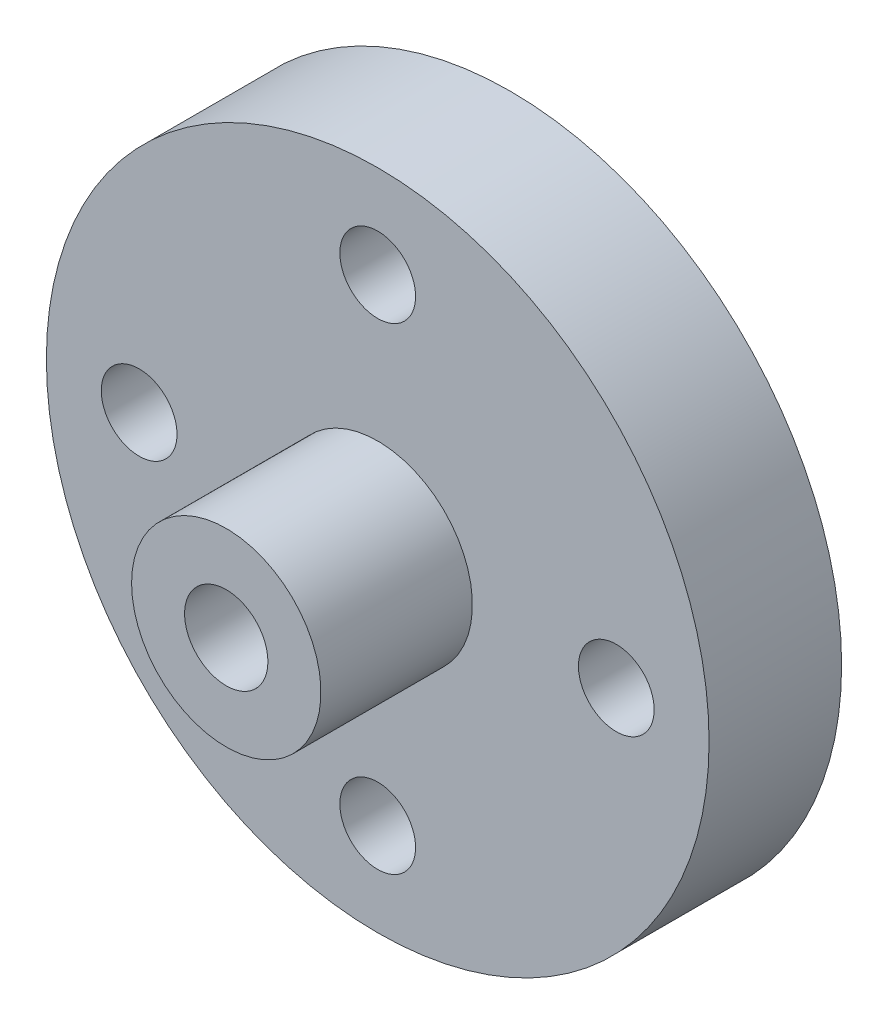
ISO-10303-21;
HEADER;
FILE_DESCRIPTION(('STEP AP214'),'2;1');
FILE_NAME('part.step','',(''),(''),'','','');
FILE_SCHEMA(('AUTOMOTIVE_DESIGN { 1 0 10303 214 1 1 1 1 }'));
ENDSEC;
DATA;
#1=APPLICATION_CONTEXT('core data for automotive mechanical design processes');
#2=APPLICATION_PROTOCOL_DEFINITION('international standard','automotive_design',2000,#1);
#3=PRODUCT_CONTEXT('',#1,'mechanical');
#4=PRODUCT('Part','Part','',(#3));
#5=PRODUCT_RELATED_PRODUCT_CATEGORY('part','',(#4));
#6=PRODUCT_DEFINITION_FORMATION('','',#4);
#7=PRODUCT_DEFINITION_CONTEXT('part definition',#1,'design');
#8=PRODUCT_DEFINITION('design','',#6,#7);
#9=PRODUCT_DEFINITION_SHAPE('','',#8);
#10=(LENGTH_UNIT() NAMED_UNIT(*) SI_UNIT(.MILLI.,.METRE.));
#11=(NAMED_UNIT(*) PLANE_ANGLE_UNIT() SI_UNIT($,.RADIAN.));
#12=(NAMED_UNIT(*) SI_UNIT($,.STERADIAN.) SOLID_ANGLE_UNIT());
#13=UNCERTAINTY_MEASURE_WITH_UNIT(LENGTH_MEASURE(1.E-05),#10,'distance_accuracy_value','');
#14=(GEOMETRIC_REPRESENTATION_CONTEXT(3) GLOBAL_UNCERTAINTY_ASSIGNED_CONTEXT((#13)) GLOBAL_UNIT_ASSIGNED_CONTEXT((#10,
#11,#12)) REPRESENTATION_CONTEXT('',''));
#15=CARTESIAN_POINT('',(0.,0.,0.));
#16=DIRECTION('',(0.,0.,1.));
#17=DIRECTION('',(1.,0.,0.));
#18=AXIS2_PLACEMENT_3D('',#15,#16,#17);
#19=CARTESIAN_POINT('',(0.,0.,3.175));
#20=DIRECTION('',(0.,0.,1.));
#21=DIRECTION('',(1.,0.,0.));
#22=AXIS2_PLACEMENT_3D('',#19,#20,#21);
#23=PLANE('',#22);
#24=CARTESIAN_POINT('',(0.,0.,3.175));
#25=DIRECTION('',(0.,0.,1.));
#26=DIRECTION('',(1.,0.,0.));
#27=AXIS2_PLACEMENT_3D('',#24,#25,#26);
#28=CIRCLE('',#27,1.397);
#29=CARTESIAN_POINT('',(1.397,0.,3.175));
#30=VERTEX_POINT('',#29);
#31=EDGE_CURVE('E17',#30,#30,#28,.T.);
#32=ORIENTED_EDGE('',*,*,#31,.T.);
#33=EDGE_LOOP('',(#32));
#34=FACE_BOUND('',#33,.T.);
#35=CARTESIAN_POINT('',(0.,0.,3.175));
#36=DIRECTION('',(0.,0.,-1.));
#37=DIRECTION('',(-1.,0.,0.));
#38=AXIS2_PLACEMENT_3D('',#35,#36,#37);
#39=CIRCLE('',#38,4.);
#40=CARTESIAN_POINT('',(-4.,0.,3.175));
#41=VERTEX_POINT('',#40);
#42=EDGE_CURVE('E63',#41,#41,#39,.T.);
#43=ORIENTED_EDGE('',*,*,#42,.T.);
#44=EDGE_LOOP('',(#43));
#45=FACE_BOUND('',#44,.T.);
#46=ADVANCED_FACE('F14',(#34,#45),#23,.F.);
#47=CARTESIAN_POINT('',(0.,0.,9.525));
#48=DIRECTION('',(0.,0.,1.));
#49=DIRECTION('',(1.,0.,0.));
#50=AXIS2_PLACEMENT_3D('',#47,#48,#49);
#51=CYLINDRICAL_SURFACE('',#50,1.397);
#52=CARTESIAN_POINT('',(0.,0.,9.525));
#53=DIRECTION('',(0.,0.,1.));
#54=DIRECTION('',(1.,0.,0.));
#55=AXIS2_PLACEMENT_3D('',#52,#53,#54);
#56=CIRCLE('',#55,1.397);
#57=CARTESIAN_POINT('',(1.397,0.,9.525));
#58=VERTEX_POINT('',#57);
#59=EDGE_CURVE('E61',#58,#58,#56,.F.);
#60=ORIENTED_EDGE('',*,*,#59,.F.);
#61=EDGE_LOOP('',(#60));
#62=FACE_BOUND('',#61,.T.);
#63=ORIENTED_EDGE('',*,*,#31,.F.);
#64=EDGE_LOOP('',(#63));
#65=FACE_BOUND('',#64,.T.);
#66=ADVANCED_FACE('F71',(#62,#65),#51,.F.);
#67=CARTESIAN_POINT('',(0.,0.,3.175));
#68=DIRECTION('',(0.,0.,-1.));
#69=DIRECTION('',(-1.,0.,0.));
#70=AXIS2_PLACEMENT_3D('',#67,#68,#69);
#71=CYLINDRICAL_SURFACE('',#70,4.);
#72=CARTESIAN_POINT('',(0.,0.,0.));
#73=DIRECTION('',(0.,0.,-1.));
#74=DIRECTION('',(-1.,0.,0.));
#75=AXIS2_PLACEMENT_3D('',#72,#73,#74);
#76=CIRCLE('',#75,4.);
#77=CARTESIAN_POINT('',(-4.,0.,0.));
#78=VERTEX_POINT('',#77);
#79=EDGE_CURVE('E58',#78,#78,#76,.T.);
#80=ORIENTED_EDGE('',*,*,#79,.T.);
#81=EDGE_LOOP('',(#80));
#82=FACE_BOUND('',#81,.T.);
#83=ORIENTED_EDGE('',*,*,#42,.F.);
#84=EDGE_LOOP('',(#83));
#85=FACE_BOUND('',#84,.T.);
#86=ADVANCED_FACE('F73',(#82,#85),#71,.F.);
#87=CARTESIAN_POINT('',(0.,0.,9.525));
#88=DIRECTION('',(0.,0.,1.));
#89=DIRECTION('',(1.,0.,0.));
#90=AXIS2_PLACEMENT_3D('',#87,#88,#89);
#91=PLANE('',#90);
#92=ORIENTED_EDGE('',*,*,#59,.T.);
#93=EDGE_LOOP('',(#92));
#94=FACE_BOUND('',#93,.T.);
#95=CARTESIAN_POINT('',(0.,0.,9.525));
#96=DIRECTION('',(0.,0.,-1.));
#97=DIRECTION('',(-1.,0.,0.));
#98=AXIS2_PLACEMENT_3D('',#95,#96,#97);
#99=CIRCLE('',#98,3.175);
#100=CARTESIAN_POINT('',(-3.175,0.,9.525));
#101=VERTEX_POINT('',#100);
#102=EDGE_CURVE('E52',#101,#101,#99,.T.);
#103=ORIENTED_EDGE('',*,*,#102,.F.);
#104=EDGE_LOOP('',(#103));
#105=FACE_BOUND('',#104,.T.);
#106=ADVANCED_FACE('F80',(#94,#105),#91,.T.);
#107=CARTESIAN_POINT('',(0.,0.,0.));
#108=DIRECTION('',(0.,0.,1.));
#109=DIRECTION('',(1.,0.,0.));
#110=AXIS2_PLACEMENT_3D('',#107,#108,#109);
#111=PLANE('',#110);
#112=CARTESIAN_POINT('',(8.001,0.,0.));
#113=DIRECTION('',(0.,0.,-1.));
#114=DIRECTION('',(-1.,0.,0.));
#115=AXIS2_PLACEMENT_3D('',#112,#113,#114);
#116=CIRCLE('',#115,1.27);
#117=CARTESIAN_POINT('',(6.731,0.,0.));
#118=VERTEX_POINT('',#117);
#119=EDGE_CURVE('E40',#118,#118,#116,.F.);
#120=ORIENTED_EDGE('',*,*,#119,.T.);
#121=EDGE_LOOP('',(#120));
#122=FACE_BOUND('',#121,.T.);
#123=CARTESIAN_POINT('',(0.,8.001,0.));
#124=DIRECTION('',(0.,0.,-1.));
#125=DIRECTION('',(-1.,0.,0.));
#126=AXIS2_PLACEMENT_3D('',#123,#124,#125);
#127=CIRCLE('',#126,1.27);
#128=CARTESIAN_POINT('',(-1.27,8.001,0.));
#129=VERTEX_POINT('',#128);
#130=EDGE_CURVE('E43',#129,#129,#127,.F.);
#131=ORIENTED_EDGE('',*,*,#130,.T.);
#132=EDGE_LOOP('',(#131));
#133=FACE_BOUND('',#132,.T.);
#134=CARTESIAN_POINT('',(-8.001,0.,0.));
#135=DIRECTION('',(0.,0.,-1.));
#136=DIRECTION('',(-1.,0.,0.));
#137=AXIS2_PLACEMENT_3D('',#134,#135,#136);
#138=CIRCLE('',#137,1.27);
#139=CARTESIAN_POINT('',(-9.271,0.,0.));
#140=VERTEX_POINT('',#139);
#141=EDGE_CURVE('E46',#140,#140,#138,.F.);
#142=ORIENTED_EDGE('',*,*,#141,.T.);
#143=EDGE_LOOP('',(#142));
#144=FACE_BOUND('',#143,.T.);
#145=CARTESIAN_POINT('',(0.,-8.001,0.));
#146=DIRECTION('',(0.,0.,-1.));
#147=DIRECTION('',(-1.,0.,0.));
#148=AXIS2_PLACEMENT_3D('',#145,#146,#147);
#149=CIRCLE('',#148,1.27);
#150=CARTESIAN_POINT('',(-1.27,-8.001,0.));
#151=VERTEX_POINT('',#150);
#152=EDGE_CURVE('E49',#151,#151,#149,.F.);
#153=ORIENTED_EDGE('',*,*,#152,.T.);
#154=EDGE_LOOP('',(#153));
#155=FACE_BOUND('',#154,.T.);
#156=ORIENTED_EDGE('',*,*,#79,.F.);
#157=EDGE_LOOP('',(#156));
#158=FACE_BOUND('',#157,.T.);
#159=CARTESIAN_POINT('',(0.,0.,0.));
#160=DIRECTION('',(0.,0.,-1.));
#161=DIRECTION('',(-1.,0.,0.));
#162=AXIS2_PLACEMENT_3D('',#159,#160,#161);
#163=CIRCLE('',#162,11.1125);
#164=CARTESIAN_POINT('',(-11.1125,0.,0.));
#165=VERTEX_POINT('',#164);
#166=EDGE_CURVE('E55',#165,#165,#163,.F.);
#167=ORIENTED_EDGE('',*,*,#166,.F.);
#168=EDGE_LOOP('',(#167));
#169=FACE_BOUND('',#168,.T.);
#170=ADVANCED_FACE('F114',(#122,#133,#144,#155,#158,#169),#111,.F.);
#171=CARTESIAN_POINT('',(0.,0.,3.175));
#172=DIRECTION('',(0.,0.,-1.));
#173=DIRECTION('',(-1.,0.,0.));
#174=AXIS2_PLACEMENT_3D('',#171,#172,#173);
#175=CYLINDRICAL_SURFACE('',#174,11.1125);
#176=ORIENTED_EDGE('',*,*,#166,.T.);
#177=EDGE_LOOP('',(#176));
#178=FACE_BOUND('',#177,.T.);
#179=CARTESIAN_POINT('',(0.,0.,4.445));
#180=DIRECTION('',(0.,0.,-1.));
#181=DIRECTION('',(-1.,0.,0.));
#182=AXIS2_PLACEMENT_3D('',#179,#180,#181);
#183=CIRCLE('',#182,11.1125);
#184=CARTESIAN_POINT('',(-11.1125,0.,4.445));
#185=VERTEX_POINT('',#184);
#186=EDGE_CURVE('E37',#185,#185,#183,.F.);
#187=ORIENTED_EDGE('',*,*,#186,.F.);
#188=EDGE_LOOP('',(#187));
#189=FACE_BOUND('',#188,.T.);
#190=ADVANCED_FACE('F110',(#178,#189),#175,.T.);
#191=CARTESIAN_POINT('',(0.,0.,42.545));
#192=DIRECTION('',(0.,0.,-1.));
#193=DIRECTION('',(-1.,0.,0.));
#194=AXIS2_PLACEMENT_3D('',#191,#192,#193);
#195=CYLINDRICAL_SURFACE('',#194,3.175);
#196=CARTESIAN_POINT('',(0.,0.,4.445));
#197=DIRECTION('',(0.,0.,-1.));
#198=DIRECTION('',(-1.,0.,0.));
#199=AXIS2_PLACEMENT_3D('',#196,#197,#198);
#200=CIRCLE('',#199,3.175);
#201=CARTESIAN_POINT('',(-3.175,0.,4.445));
#202=VERTEX_POINT('',#201);
#203=EDGE_CURVE('E34',#202,#202,#200,.T.);
#204=ORIENTED_EDGE('',*,*,#203,.F.);
#205=EDGE_LOOP('',(#204));
#206=FACE_BOUND('',#205,.T.);
#207=ORIENTED_EDGE('',*,*,#102,.T.);
#208=EDGE_LOOP('',(#207));
#209=FACE_BOUND('',#208,.T.);
#210=ADVANCED_FACE('F106',(#206,#209),#195,.T.);
#211=CARTESIAN_POINT('',(0.,-8.001,0.));
#212=DIRECTION('',(0.,0.,-1.));
#213=DIRECTION('',(-1.,0.,0.));
#214=AXIS2_PLACEMENT_3D('',#211,#212,#213);
#215=CYLINDRICAL_SURFACE('',#214,1.27);
#216=ORIENTED_EDGE('',*,*,#152,.F.);
#217=EDGE_LOOP('',(#216));
#218=FACE_BOUND('',#217,.T.);
#219=CARTESIAN_POINT('',(0.,-8.001,4.445));
#220=DIRECTION('',(0.,0.,-1.));
#221=DIRECTION('',(-1.,0.,0.));
#222=AXIS2_PLACEMENT_3D('',#219,#220,#221);
#223=CIRCLE('',#222,1.27);
#224=CARTESIAN_POINT('',(-1.27,-8.001,4.445));
#225=VERTEX_POINT('',#224);
#226=EDGE_CURVE('E31',#225,#225,#223,.T.);
#227=ORIENTED_EDGE('',*,*,#226,.F.);
#228=EDGE_LOOP('',(#227));
#229=FACE_BOUND('',#228,.T.);
#230=ADVANCED_FACE('F102',(#218,#229),#215,.F.);
#231=CARTESIAN_POINT('',(-8.001,0.,0.));
#232=DIRECTION('',(0.,0.,-1.));
#233=DIRECTION('',(-1.,0.,0.));
#234=AXIS2_PLACEMENT_3D('',#231,#232,#233);
#235=CYLINDRICAL_SURFACE('',#234,1.27);
#236=ORIENTED_EDGE('',*,*,#141,.F.);
#237=EDGE_LOOP('',(#236));
#238=FACE_BOUND('',#237,.T.);
#239=CARTESIAN_POINT('',(-8.001,0.,4.445));
#240=DIRECTION('',(0.,0.,-1.));
#241=DIRECTION('',(-1.,0.,0.));
#242=AXIS2_PLACEMENT_3D('',#239,#240,#241);
#243=CIRCLE('',#242,1.27);
#244=CARTESIAN_POINT('',(-9.271,0.,4.445));
#245=VERTEX_POINT('',#244);
#246=EDGE_CURVE('E26',#245,#245,#243,.T.);
#247=ORIENTED_EDGE('',*,*,#246,.F.);
#248=EDGE_LOOP('',(#247));
#249=FACE_BOUND('',#248,.T.);
#250=ADVANCED_FACE('F98',(#238,#249),#235,.F.);
#251=CARTESIAN_POINT('',(0.,8.001,0.));
#252=DIRECTION('',(0.,0.,-1.));
#253=DIRECTION('',(-1.,0.,0.));
#254=AXIS2_PLACEMENT_3D('',#251,#252,#253);
#255=CYLINDRICAL_SURFACE('',#254,1.27);
#256=ORIENTED_EDGE('',*,*,#130,.F.);
#257=EDGE_LOOP('',(#256));
#258=FACE_BOUND('',#257,.T.);
#259=CARTESIAN_POINT('',(0.,8.001,4.445));
#260=DIRECTION('',(0.,0.,-1.));
#261=DIRECTION('',(-1.,0.,0.));
#262=AXIS2_PLACEMENT_3D('',#259,#260,#261);
#263=CIRCLE('',#262,1.27);
#264=CARTESIAN_POINT('',(-1.27,8.001,4.445));
#265=VERTEX_POINT('',#264);
#266=EDGE_CURVE('E21',#265,#265,#263,.T.);
#267=ORIENTED_EDGE('',*,*,#266,.F.);
#268=EDGE_LOOP('',(#267));
#269=FACE_BOUND('',#268,.T.);
#270=ADVANCED_FACE('F91',(#258,#269),#255,.F.);
#271=CARTESIAN_POINT('',(8.001,0.,0.));
#272=DIRECTION('',(0.,0.,-1.));
#273=DIRECTION('',(-1.,0.,0.));
#274=AXIS2_PLACEMENT_3D('',#271,#272,#273);
#275=CYLINDRICAL_SURFACE('',#274,1.27);
#276=ORIENTED_EDGE('',*,*,#119,.F.);
#277=EDGE_LOOP('',(#276));
#278=FACE_BOUND('',#277,.T.);
#279=CARTESIAN_POINT('',(8.001,0.,4.445));
#280=DIRECTION('',(0.,0.,-1.));
#281=DIRECTION('',(-1.,0.,0.));
#282=AXIS2_PLACEMENT_3D('',#279,#280,#281);
#283=CIRCLE('',#282,1.27);
#284=CARTESIAN_POINT('',(6.731,0.,4.445));
#285=VERTEX_POINT('',#284);
#286=EDGE_CURVE('E10',#285,#285,#283,.T.);
#287=ORIENTED_EDGE('',*,*,#286,.F.);
#288=EDGE_LOOP('',(#287));
#289=FACE_BOUND('',#288,.T.);
#290=ADVANCED_FACE('F86',(#278,#289),#275,.F.);
#291=CARTESIAN_POINT('',(0.,0.,4.445));
#292=DIRECTION('',(0.,0.,1.));
#293=DIRECTION('',(1.,0.,0.));
#294=AXIS2_PLACEMENT_3D('',#291,#292,#293);
#295=PLANE('',#294);
#296=ORIENTED_EDGE('',*,*,#286,.T.);
#297=EDGE_LOOP('',(#296));
#298=FACE_BOUND('',#297,.T.);
#299=ORIENTED_EDGE('',*,*,#266,.T.);
#300=EDGE_LOOP('',(#299));
#301=FACE_BOUND('',#300,.T.);
#302=ORIENTED_EDGE('',*,*,#246,.T.);
#303=EDGE_LOOP('',(#302));
#304=FACE_BOUND('',#303,.T.);
#305=ORIENTED_EDGE('',*,*,#226,.T.);
#306=EDGE_LOOP('',(#305));
#307=FACE_BOUND('',#306,.T.);
#308=ORIENTED_EDGE('',*,*,#203,.T.);
#309=EDGE_LOOP('',(#308));
#310=FACE_BOUND('',#309,.T.);
#311=ORIENTED_EDGE('',*,*,#186,.T.);
#312=EDGE_LOOP('',(#311));
#313=FACE_BOUND('',#312,.T.);
#314=ADVANCED_FACE('F84',(#298,#301,#304,#307,#310,#313),#295,.T.);
#315=CLOSED_SHELL('',(#46,#66,#86,#106,#170,#190,#210,#230,#250,#270,#290,#314));
#316=MANIFOLD_SOLID_BREP('B1',#315);
#317=ADVANCED_BREP_SHAPE_REPRESENTATION('',(#18,#316),#14);
#318=SHAPE_DEFINITION_REPRESENTATION(#9,#317);
ENDSEC;
END-ISO-10303-21;
